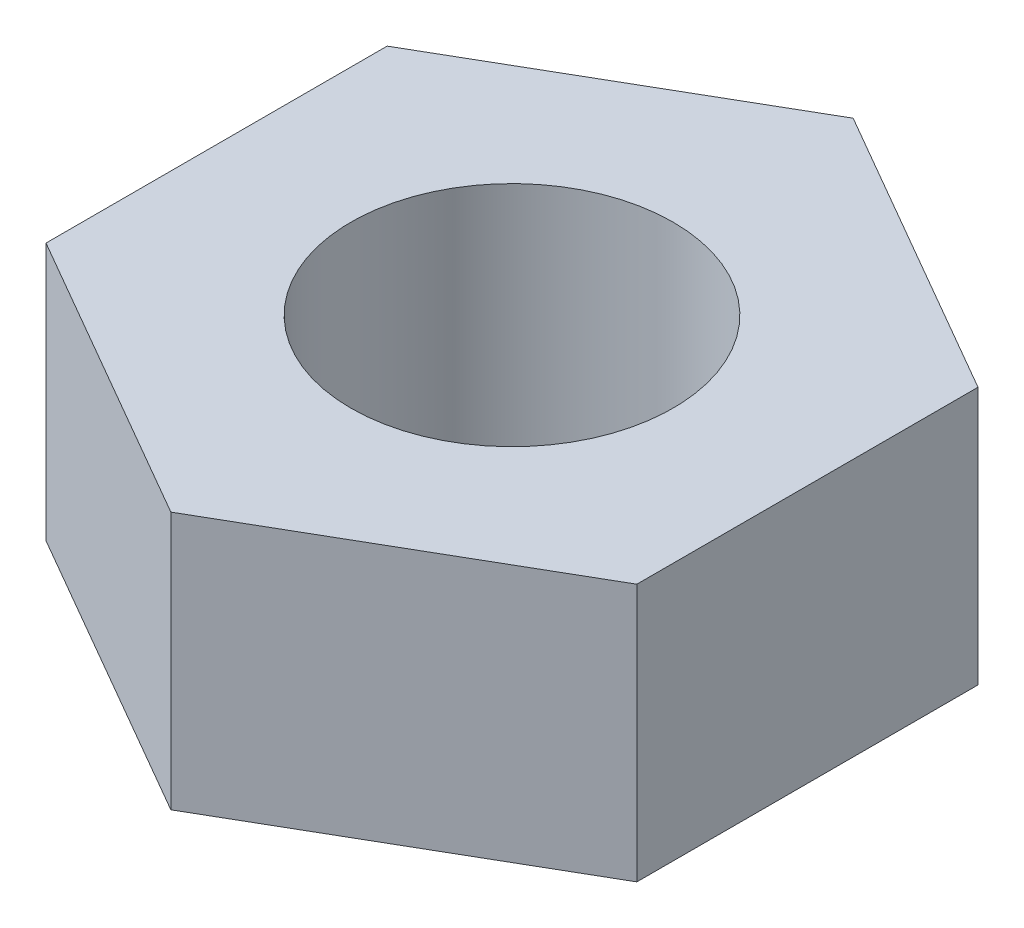
ISO-10303-21;
HEADER;
FILE_DESCRIPTION(('STEP AP214'),'2;1');
FILE_NAME('part.step','',(''),(''),'','','');
FILE_SCHEMA(('AUTOMOTIVE_DESIGN { 1 0 10303 214 1 1 1 1 }'));
ENDSEC;
DATA;
#1=APPLICATION_CONTEXT('core data for automotive mechanical design processes');
#2=APPLICATION_PROTOCOL_DEFINITION('international standard','automotive_design',2000,#1);
#3=PRODUCT_CONTEXT('',#1,'mechanical');
#4=PRODUCT('Part','Part','',(#3));
#5=PRODUCT_RELATED_PRODUCT_CATEGORY('part','',(#4));
#6=PRODUCT_DEFINITION_FORMATION('','',#4);
#7=PRODUCT_DEFINITION_CONTEXT('part definition',#1,'design');
#8=PRODUCT_DEFINITION('design','',#6,#7);
#9=PRODUCT_DEFINITION_SHAPE('','',#8);
#10=(LENGTH_UNIT() NAMED_UNIT(*) SI_UNIT(.MILLI.,.METRE.));
#11=(NAMED_UNIT(*) PLANE_ANGLE_UNIT() SI_UNIT($,.RADIAN.));
#12=(NAMED_UNIT(*) SI_UNIT($,.STERADIAN.) SOLID_ANGLE_UNIT());
#13=UNCERTAINTY_MEASURE_WITH_UNIT(LENGTH_MEASURE(1.E-05),#10,'distance_accuracy_value','');
#14=(GEOMETRIC_REPRESENTATION_CONTEXT(3) GLOBAL_UNCERTAINTY_ASSIGNED_CONTEXT((#13)) GLOBAL_UNIT_ASSIGNED_CONTEXT((#10,
#11,#12)) REPRESENTATION_CONTEXT('',''));
#15=CARTESIAN_POINT('',(0.,0.,0.));
#16=DIRECTION('',(0.,0.,1.));
#17=DIRECTION('',(1.,0.,0.));
#18=AXIS2_PLACEMENT_3D('',#15,#16,#17);
#19=CARTESIAN_POINT('',(0.,2.4,0.));
#20=DIRECTION('',(0.,1.,0.));
#21=DIRECTION('',(0.,0.,1.));
#22=AXIS2_PLACEMENT_3D('',#19,#20,#21);
#23=PLANE('',#22);
#24=DIRECTION('',(0.866025403784442,0.,0.499999999999995));
#25=VECTOR('',#24,1.);
#26=CARTESIAN_POINT('',(-2.74999999999998,2.4,1.5877132402715));
#27=LINE('',#26,#25);
#28=CARTESIAN_POINT('',(-2.74999999999998,2.4,1.5877132402715));
#29=VERTEX_POINT('',#28);
#30=CARTESIAN_POINT('',(0.,2.4,3.17542648054294));
#31=VERTEX_POINT('',#30);
#32=EDGE_CURVE('E133',#29,#31,#27,.T.);
#33=ORIENTED_EDGE('',*,*,#32,.T.);
#34=DIRECTION('',(0.866025403784438,0.,-0.500000000000001));
#35=VECTOR('',#34,1.);
#36=CARTESIAN_POINT('',(0.,2.4,3.17542648054294));
#37=LINE('',#36,#35);
#38=CARTESIAN_POINT('',(2.75000000000001,2.4,1.58771324027147));
#39=VERTEX_POINT('',#38);
#40=EDGE_CURVE('E91',#31,#39,#37,.T.);
#41=ORIENTED_EDGE('',*,*,#40,.T.);
#42=DIRECTION('',(0.,0.,-1.));
#43=VECTOR('',#42,1.);
#44=CARTESIAN_POINT('',(2.75000000000001,2.4,1.58771324027147));
#45=LINE('',#44,#43);
#46=CARTESIAN_POINT('',(2.74999999999999,2.4,-1.58771324027148));
#47=VERTEX_POINT('',#46);
#48=EDGE_CURVE('E104',#39,#47,#45,.T.);
#49=ORIENTED_EDGE('',*,*,#48,.T.);
#50=DIRECTION('',(-0.866025403784441,0.,-0.499999999999995));
#51=VECTOR('',#50,1.);
#52=CARTESIAN_POINT('',(2.74999999999999,2.4,-1.58771324027148));
#53=LINE('',#52,#51);
#54=CARTESIAN_POINT('',(0.,2.4,-3.17542648054294));
#55=VERTEX_POINT('',#54);
#56=EDGE_CURVE('E98',#47,#55,#53,.T.);
#57=ORIENTED_EDGE('',*,*,#56,.T.);
#58=DIRECTION('',(-0.866025403784435,0.,0.500000000000007));
#59=VECTOR('',#58,1.);
#60=CARTESIAN_POINT('',(0.,2.4,-3.17542648054294));
#61=LINE('',#60,#59);
#62=CARTESIAN_POINT('',(-2.75000000000002,2.4,-1.58771324027145));
#63=VERTEX_POINT('',#62);
#64=EDGE_CURVE('E102',#55,#63,#61,.T.);
#65=ORIENTED_EDGE('',*,*,#64,.T.);
#66=DIRECTION('',(0.,0.,1.));
#67=VECTOR('',#66,1.);
#68=CARTESIAN_POINT('',(-2.75000000000002,2.4,-1.58771324027145));
#69=LINE('',#68,#67);
#70=EDGE_CURVE('E54',#63,#29,#69,.T.);
#71=ORIENTED_EDGE('',*,*,#70,.T.);
#72=EDGE_LOOP('',(#33,#41,#49,#57,#65,#71));
#73=FACE_BOUND('',#72,.T.);
#74=CARTESIAN_POINT('',(0.,2.4,0.));
#75=DIRECTION('',(0.,1.,0.));
#76=DIRECTION('',(0.,0.,1.));
#77=AXIS2_PLACEMENT_3D('',#74,#75,#76);
#78=CIRCLE('',#77,1.5);
#79=CARTESIAN_POINT('',(0.,2.4,1.5));
#80=VERTEX_POINT('',#79);
#81=EDGE_CURVE('E126',#80,#80,#78,.T.);
#82=ORIENTED_EDGE('',*,*,#81,.F.);
#83=EDGE_LOOP('',(#82));
#84=FACE_BOUND('',#83,.T.);
#85=ADVANCED_FACE('F37',(#73,#84),#23,.T.);
#86=CARTESIAN_POINT('',(0.,0.,0.));
#87=DIRECTION('',(0.,1.,0.));
#88=DIRECTION('',(0.,0.,1.));
#89=AXIS2_PLACEMENT_3D('',#86,#87,#88);
#90=PLANE('',#89);
#91=DIRECTION('',(0.866025403784442,0.,0.499999999999995));
#92=VECTOR('',#91,1.);
#93=CARTESIAN_POINT('',(-2.74999999999998,0.,1.5877132402715));
#94=LINE('',#93,#92);
#95=CARTESIAN_POINT('',(-2.74999999999998,0.,1.5877132402715));
#96=VERTEX_POINT('',#95);
#97=CARTESIAN_POINT('',(0.,0.,3.17542648054294));
#98=VERTEX_POINT('',#97);
#99=EDGE_CURVE('E122',#96,#98,#94,.T.);
#100=ORIENTED_EDGE('',*,*,#99,.F.);
#101=DIRECTION('',(0.,0.,1.));
#102=VECTOR('',#101,1.);
#103=CARTESIAN_POINT('',(-2.75000000000002,0.,-1.58771324027145));
#104=LINE('',#103,#102);
#105=CARTESIAN_POINT('',(-2.75000000000002,0.,-1.58771324027145));
#106=VERTEX_POINT('',#105);
#107=EDGE_CURVE('E83',#106,#96,#104,.T.);
#108=ORIENTED_EDGE('',*,*,#107,.F.);
#109=DIRECTION('',(-0.866025403784435,0.,0.500000000000007));
#110=VECTOR('',#109,1.);
#111=CARTESIAN_POINT('',(0.,0.,-3.17542648054294));
#112=LINE('',#111,#110);
#113=CARTESIAN_POINT('',(0.,0.,-3.17542648054294));
#114=VERTEX_POINT('',#113);
#115=EDGE_CURVE('E77',#114,#106,#112,.T.);
#116=ORIENTED_EDGE('',*,*,#115,.F.);
#117=DIRECTION('',(-0.866025403784441,0.,-0.499999999999995));
#118=VECTOR('',#117,1.);
#119=CARTESIAN_POINT('',(2.74999999999999,0.,-1.58771324027148));
#120=LINE('',#119,#118);
#121=CARTESIAN_POINT('',(2.74999999999999,0.,-1.58771324027148));
#122=VERTEX_POINT('',#121);
#123=EDGE_CURVE('E112',#122,#114,#120,.T.);
#124=ORIENTED_EDGE('',*,*,#123,.F.);
#125=DIRECTION('',(0.,0.,-1.));
#126=VECTOR('',#125,1.);
#127=CARTESIAN_POINT('',(2.75000000000001,0.,1.58771324027147));
#128=LINE('',#127,#126);
#129=CARTESIAN_POINT('',(2.75000000000001,0.,1.58771324027147));
#130=VERTEX_POINT('',#129);
#131=EDGE_CURVE('E128',#130,#122,#128,.T.);
#132=ORIENTED_EDGE('',*,*,#131,.F.);
#133=DIRECTION('',(0.866025403784438,0.,-0.500000000000001));
#134=VECTOR('',#133,1.);
#135=CARTESIAN_POINT('',(0.,0.,3.17542648054294));
#136=LINE('',#135,#134);
#137=EDGE_CURVE('E125',#98,#130,#136,.T.);
#138=ORIENTED_EDGE('',*,*,#137,.F.);
#139=EDGE_LOOP('',(#100,#108,#116,#124,#132,#138));
#140=FACE_BOUND('',#139,.T.);
#141=CARTESIAN_POINT('',(0.,0.,0.));
#142=DIRECTION('',(0.,1.,0.));
#143=DIRECTION('',(0.,0.,1.));
#144=AXIS2_PLACEMENT_3D('',#141,#142,#143);
#145=CIRCLE('',#144,1.5);
#146=CARTESIAN_POINT('',(0.,0.,1.5));
#147=VERTEX_POINT('',#146);
#148=EDGE_CURVE('E226',#147,#147,#145,.T.);
#149=ORIENTED_EDGE('',*,*,#148,.T.);
#150=EDGE_LOOP('',(#149));
#151=FACE_BOUND('',#150,.T.);
#152=ADVANCED_FACE('F142',(#140,#151),#90,.F.);
#153=CARTESIAN_POINT('',(-2.74999999999998,2.4,1.5877132402715));
#154=DIRECTION('',(0.499999999999995,0.,-0.866025403784441));
#155=DIRECTION('',(-0.866025403784442,0.,-0.499999999999995));
#156=AXIS2_PLACEMENT_3D('',#153,#154,#155);
#157=PLANE('',#156);
#158=ORIENTED_EDGE('',*,*,#99,.T.);
#159=DIRECTION('',(0.,-1.,0.));
#160=VECTOR('',#159,1.);
#161=CARTESIAN_POINT('',(0.,2.4,3.17542648054294));
#162=LINE('',#161,#160);
#163=EDGE_CURVE('E11',#31,#98,#162,.T.);
#164=ORIENTED_EDGE('',*,*,#163,.F.);
#165=ORIENTED_EDGE('',*,*,#32,.F.);
#166=DIRECTION('',(0.,-1.,0.));
#167=VECTOR('',#166,1.);
#168=CARTESIAN_POINT('',(-2.74999999999998,2.4,1.5877132402715));
#169=LINE('',#168,#167);
#170=EDGE_CURVE('E118',#29,#96,#169,.T.);
#171=ORIENTED_EDGE('',*,*,#170,.T.);
#172=EDGE_LOOP('',(#158,#164,#165,#171));
#173=FACE_BOUND('',#172,.T.);
#174=ADVANCED_FACE('F39',(#173),#157,.F.);
#175=CARTESIAN_POINT('',(0.,2.4,3.17542648054294));
#176=DIRECTION('',(-0.500000000000001,0.,-0.866025403784438));
#177=DIRECTION('',(-0.866025403784438,0.,0.500000000000001));
#178=AXIS2_PLACEMENT_3D('',#175,#176,#177);
#179=PLANE('',#178);
#180=ORIENTED_EDGE('',*,*,#137,.T.);
#181=DIRECTION('',(0.,-1.,0.));
#182=VECTOR('',#181,1.);
#183=CARTESIAN_POINT('',(2.75000000000001,2.4,1.58771324027147));
#184=LINE('',#183,#182);
#185=EDGE_CURVE('E46',#39,#130,#184,.T.);
#186=ORIENTED_EDGE('',*,*,#185,.F.);
#187=ORIENTED_EDGE('',*,*,#40,.F.);
#188=ORIENTED_EDGE('',*,*,#163,.T.);
#189=EDGE_LOOP('',(#180,#186,#187,#188));
#190=FACE_BOUND('',#189,.T.);
#191=ADVANCED_FACE('F167',(#190),#179,.F.);
#192=CARTESIAN_POINT('',(2.75000000000001,2.4,1.58771324027147));
#193=DIRECTION('',(-1.,0.,0.));
#194=DIRECTION('',(0.,0.,1.));
#195=AXIS2_PLACEMENT_3D('',#192,#193,#194);
#196=PLANE('',#195);
#197=ORIENTED_EDGE('',*,*,#131,.T.);
#198=DIRECTION('',(0.,-1.,0.));
#199=VECTOR('',#198,1.);
#200=CARTESIAN_POINT('',(2.74999999999999,2.4,-1.58771324027148));
#201=LINE('',#200,#199);
#202=EDGE_CURVE('E113',#47,#122,#201,.T.);
#203=ORIENTED_EDGE('',*,*,#202,.F.);
#204=ORIENTED_EDGE('',*,*,#48,.F.);
#205=ORIENTED_EDGE('',*,*,#185,.T.);
#206=EDGE_LOOP('',(#197,#203,#204,#205));
#207=FACE_BOUND('',#206,.T.);
#208=ADVANCED_FACE('F139',(#207),#196,.F.);
#209=CARTESIAN_POINT('',(2.74999999999999,2.4,-1.58771324027148));
#210=DIRECTION('',(-0.499999999999995,0.,0.866025403784441));
#211=DIRECTION('',(0.866025403784442,0.,0.499999999999995));
#212=AXIS2_PLACEMENT_3D('',#209,#210,#211);
#213=PLANE('',#212);
#214=ORIENTED_EDGE('',*,*,#123,.T.);
#215=DIRECTION('',(0.,-1.,0.));
#216=VECTOR('',#215,1.);
#217=CARTESIAN_POINT('',(0.,2.4,-3.17542648054294));
#218=LINE('',#217,#216);
#219=EDGE_CURVE('E109',#55,#114,#218,.T.);
#220=ORIENTED_EDGE('',*,*,#219,.F.);
#221=ORIENTED_EDGE('',*,*,#56,.F.);
#222=ORIENTED_EDGE('',*,*,#202,.T.);
#223=EDGE_LOOP('',(#214,#220,#221,#222));
#224=FACE_BOUND('',#223,.T.);
#225=ADVANCED_FACE('F110',(#224),#213,.F.);
#226=CARTESIAN_POINT('',(0.,2.4,-3.17542648054294));
#227=DIRECTION('',(0.500000000000007,0.,0.866025403784434));
#228=DIRECTION('',(0.866025403784435,0.,-0.500000000000007));
#229=AXIS2_PLACEMENT_3D('',#226,#227,#228);
#230=PLANE('',#229);
#231=ORIENTED_EDGE('',*,*,#115,.T.);
#232=DIRECTION('',(0.,-1.,0.));
#233=VECTOR('',#232,1.);
#234=CARTESIAN_POINT('',(-2.75000000000002,2.4,-1.58771324027145));
#235=LINE('',#234,#233);
#236=EDGE_CURVE('E114',#63,#106,#235,.T.);
#237=ORIENTED_EDGE('',*,*,#236,.F.);
#238=ORIENTED_EDGE('',*,*,#64,.F.);
#239=ORIENTED_EDGE('',*,*,#219,.T.);
#240=EDGE_LOOP('',(#231,#237,#238,#239));
#241=FACE_BOUND('',#240,.T.);
#242=ADVANCED_FACE('F116',(#241),#230,.F.);
#243=CARTESIAN_POINT('',(-2.75000000000002,2.4,-1.58771324027145));
#244=DIRECTION('',(1.,0.,0.));
#245=DIRECTION('',(0.,0.,-1.));
#246=AXIS2_PLACEMENT_3D('',#243,#244,#245);
#247=PLANE('',#246);
#248=ORIENTED_EDGE('',*,*,#107,.T.);
#249=ORIENTED_EDGE('',*,*,#170,.F.);
#250=ORIENTED_EDGE('',*,*,#70,.F.);
#251=ORIENTED_EDGE('',*,*,#236,.T.);
#252=EDGE_LOOP('',(#248,#249,#250,#251));
#253=FACE_BOUND('',#252,.T.);
#254=ADVANCED_FACE('F147',(#253),#247,.F.);
#255=CARTESIAN_POINT('',(0.,2.4,0.));
#256=DIRECTION('',(0.,-1.,0.));
#257=DIRECTION('',(0.,0.,-1.));
#258=AXIS2_PLACEMENT_3D('',#255,#256,#257);
#259=CYLINDRICAL_SURFACE('',#258,1.5);
#260=ORIENTED_EDGE('',*,*,#81,.T.);
#261=EDGE_LOOP('',(#260));
#262=FACE_BOUND('',#261,.T.);
#263=ORIENTED_EDGE('',*,*,#148,.F.);
#264=EDGE_LOOP('',(#263));
#265=FACE_BOUND('',#264,.T.);
#266=ADVANCED_FACE('F149',(#262,#265),#259,.F.);
#267=CLOSED_SHELL('',(#85,#152,#174,#191,#208,#225,#242,#254,#266));
#268=MANIFOLD_SOLID_BREP('B2',#267);
#269=ADVANCED_BREP_SHAPE_REPRESENTATION('',(#18,#268),#14);
#270=SHAPE_DEFINITION_REPRESENTATION(#9,#269);
ENDSEC;
END-ISO-10303-21;
